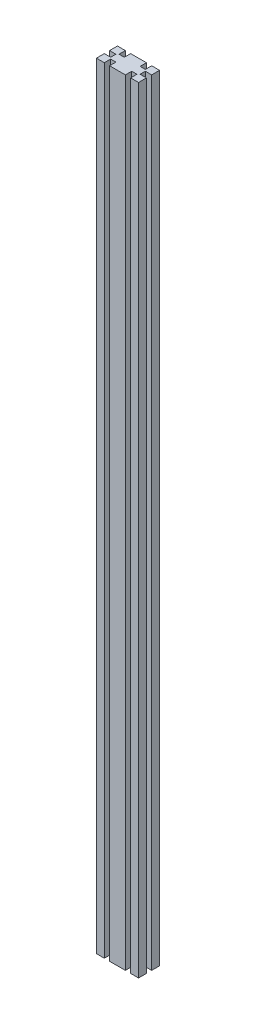
ISO-10303-21;
HEADER;
FILE_DESCRIPTION(('STEP AP214'),'2;1');
FILE_NAME('part.step','',(''),(''),'','','');
FILE_SCHEMA(('AUTOMOTIVE_DESIGN { 1 0 10303 214 1 1 1 1 }'));
ENDSEC;
DATA;
#1=APPLICATION_CONTEXT('core data for automotive mechanical design processes');
#2=APPLICATION_PROTOCOL_DEFINITION('international standard','automotive_design',2000,#1);
#3=PRODUCT_CONTEXT('',#1,'mechanical');
#4=PRODUCT('Part','Part','',(#3));
#5=PRODUCT_RELATED_PRODUCT_CATEGORY('part','',(#4));
#6=PRODUCT_DEFINITION_FORMATION('','',#4);
#7=PRODUCT_DEFINITION_CONTEXT('part definition',#1,'design');
#8=PRODUCT_DEFINITION('design','',#6,#7);
#9=PRODUCT_DEFINITION_SHAPE('','',#8);
#10=(LENGTH_UNIT() NAMED_UNIT(*) SI_UNIT(.MILLI.,.METRE.));
#11=(NAMED_UNIT(*) PLANE_ANGLE_UNIT() SI_UNIT($,.RADIAN.));
#12=(NAMED_UNIT(*) SI_UNIT($,.STERADIAN.) SOLID_ANGLE_UNIT());
#13=UNCERTAINTY_MEASURE_WITH_UNIT(LENGTH_MEASURE(1.E-05),#10,'distance_accuracy_value','');
#14=(GEOMETRIC_REPRESENTATION_CONTEXT(3) GLOBAL_UNCERTAINTY_ASSIGNED_CONTEXT((#13)) GLOBAL_UNIT_ASSIGNED_CONTEXT((#10,
#11,#12)) REPRESENTATION_CONTEXT('',''));
#15=CARTESIAN_POINT('',(0.,0.,0.));
#16=DIRECTION('',(0.,0.,1.));
#17=DIRECTION('',(1.,0.,0.));
#18=AXIS2_PLACEMENT_3D('',#15,#16,#17);
#19=CARTESIAN_POINT('',(20.,-368.3,10.));
#20=DIRECTION('',(1.,0.,0.));
#21=DIRECTION('',(0.,0.,-1.));
#22=AXIS2_PLACEMENT_3D('',#19,#20,#21);
#23=PLANE('',#22);
#24=DIRECTION('',(0.,0.,-1.));
#25=VECTOR('',#24,1.);
#26=CARTESIAN_POINT('',(20.,368.3,10.));
#27=LINE('',#26,#25);
#28=CARTESIAN_POINT('',(20.,368.3,-2.5));
#29=VERTEX_POINT('',#28);
#30=CARTESIAN_POINT('',(20.,368.3,-10.));
#31=VERTEX_POINT('',#30);
#32=EDGE_CURVE('E375',#29,#31,#27,.T.);
#33=ORIENTED_EDGE('',*,*,#32,.F.);
#34=DIRECTION('',(0.,-1.,0.));
#35=VECTOR('',#34,1.);
#36=CARTESIAN_POINT('',(20.,-368.3,-2.5));
#37=LINE('',#36,#35);
#38=CARTESIAN_POINT('',(20.,-368.3,-2.5));
#39=VERTEX_POINT('',#38);
#40=EDGE_CURVE('E357',#29,#39,#37,.T.);
#41=ORIENTED_EDGE('',*,*,#40,.T.);
#42=DIRECTION('',(0.,0.,-1.));
#43=VECTOR('',#42,1.);
#44=CARTESIAN_POINT('',(20.,-368.3,10.));
#45=LINE('',#44,#43);
#46=CARTESIAN_POINT('',(20.,-368.3,-10.));
#47=VERTEX_POINT('',#46);
#48=EDGE_CURVE('E392',#39,#47,#45,.T.);
#49=ORIENTED_EDGE('',*,*,#48,.T.);
#50=DIRECTION('',(0.,1.,0.));
#51=VECTOR('',#50,1.);
#52=CARTESIAN_POINT('',(20.,-368.3,-10.));
#53=LINE('',#52,#51);
#54=EDGE_CURVE('E37',#47,#31,#53,.T.);
#55=ORIENTED_EDGE('',*,*,#54,.T.);
#56=EDGE_LOOP('',(#33,#41,#49,#55));
#57=FACE_BOUND('',#56,.T.);
#58=ADVANCED_FACE('F33',(#57),#23,.T.);
#59=CARTESIAN_POINT('',(-20.,-368.3,10.));
#60=DIRECTION('',(0.,0.,1.));
#61=DIRECTION('',(1.,0.,0.));
#62=AXIS2_PLACEMENT_3D('',#59,#60,#61);
#63=PLANE('',#62);
#64=DIRECTION('',(1.,0.,0.));
#65=VECTOR('',#64,1.);
#66=CARTESIAN_POINT('',(-20.,368.3,10.));
#67=LINE('',#66,#65);
#68=CARTESIAN_POINT('',(-7.5,368.3,10.));
#69=VERTEX_POINT('',#68);
#70=CARTESIAN_POINT('',(7.5,368.3,10.));
#71=VERTEX_POINT('',#70);
#72=EDGE_CURVE('E393',#69,#71,#67,.T.);
#73=ORIENTED_EDGE('',*,*,#72,.F.);
#74=DIRECTION('',(0.,-1.,0.));
#75=VECTOR('',#74,1.);
#76=CARTESIAN_POINT('',(-7.5,-368.3,10.));
#77=LINE('',#76,#75);
#78=CARTESIAN_POINT('',(-7.5,-368.3,10.));
#79=VERTEX_POINT('',#78);
#80=EDGE_CURVE('E372',#69,#79,#77,.T.);
#81=ORIENTED_EDGE('',*,*,#80,.T.);
#82=DIRECTION('',(1.,0.,0.));
#83=VECTOR('',#82,1.);
#84=CARTESIAN_POINT('',(-20.,-368.3,10.));
#85=LINE('',#84,#83);
#86=CARTESIAN_POINT('',(7.5,-368.3,10.));
#87=VERTEX_POINT('',#86);
#88=EDGE_CURVE('E409',#79,#87,#85,.T.);
#89=ORIENTED_EDGE('',*,*,#88,.T.);
#90=DIRECTION('',(0.,-1.,0.));
#91=VECTOR('',#90,1.);
#92=CARTESIAN_POINT('',(7.5,-368.3,10.));
#93=LINE('',#92,#91);
#94=EDGE_CURVE('E352',#71,#87,#93,.T.);
#95=ORIENTED_EDGE('',*,*,#94,.F.);
#96=EDGE_LOOP('',(#73,#81,#89,#95));
#97=FACE_BOUND('',#96,.T.);
#98=ADVANCED_FACE('F493',(#97),#63,.T.);
#99=CARTESIAN_POINT('',(12.5,368.3,10.));
#100=VERTEX_POINT('',#99);
#101=CARTESIAN_POINT('',(20.,368.3,10.));
#102=VERTEX_POINT('',#101);
#103=EDGE_CURVE('E388',#100,#102,#67,.T.);
#104=ORIENTED_EDGE('',*,*,#103,.F.);
#105=DIRECTION('',(0.,-1.,0.));
#106=VECTOR('',#105,1.);
#107=CARTESIAN_POINT('',(12.5,-368.3,10.));
#108=LINE('',#107,#106);
#109=CARTESIAN_POINT('',(12.5,-368.3,10.));
#110=VERTEX_POINT('',#109);
#111=EDGE_CURVE('E236',#100,#110,#108,.T.);
#112=ORIENTED_EDGE('',*,*,#111,.T.);
#113=CARTESIAN_POINT('',(20.,-368.3,10.));
#114=VERTEX_POINT('',#113);
#115=EDGE_CURVE('E406',#110,#114,#85,.T.);
#116=ORIENTED_EDGE('',*,*,#115,.T.);
#117=DIRECTION('',(0.,1.,0.));
#118=VECTOR('',#117,1.);
#119=CARTESIAN_POINT('',(20.,-368.3,10.));
#120=LINE('',#119,#118);
#121=EDGE_CURVE('E11',#114,#102,#120,.T.);
#122=ORIENTED_EDGE('',*,*,#121,.T.);
#123=EDGE_LOOP('',(#104,#112,#116,#122));
#124=FACE_BOUND('',#123,.T.);
#125=ADVANCED_FACE('F497',(#124),#63,.T.);
#126=CARTESIAN_POINT('',(-20.,-368.3,10.));
#127=DIRECTION('',(-1.,0.,0.));
#128=DIRECTION('',(0.,0.,1.));
#129=AXIS2_PLACEMENT_3D('',#126,#127,#128);
#130=PLANE('',#129);
#131=DIRECTION('',(0.,0.,1.));
#132=VECTOR('',#131,1.);
#133=CARTESIAN_POINT('',(-20.,368.3,10.));
#134=LINE('',#133,#132);
#135=CARTESIAN_POINT('',(-20.,368.3,2.5));
#136=VERTEX_POINT('',#135);
#137=CARTESIAN_POINT('',(-20.,368.3,10.));
#138=VERTEX_POINT('',#137);
#139=EDGE_CURVE('E383',#136,#138,#134,.T.);
#140=ORIENTED_EDGE('',*,*,#139,.F.);
#141=DIRECTION('',(0.,-1.,0.));
#142=VECTOR('',#141,1.);
#143=CARTESIAN_POINT('',(-20.,-368.3,2.5));
#144=LINE('',#143,#142);
#145=CARTESIAN_POINT('',(-20.,-368.3,2.5));
#146=VERTEX_POINT('',#145);
#147=EDGE_CURVE('E365',#136,#146,#144,.T.);
#148=ORIENTED_EDGE('',*,*,#147,.T.);
#149=DIRECTION('',(0.,0.,1.));
#150=VECTOR('',#149,1.);
#151=CARTESIAN_POINT('',(-20.,-368.3,10.));
#152=LINE('',#151,#150);
#153=CARTESIAN_POINT('',(-20.,-368.3,10.));
#154=VERTEX_POINT('',#153);
#155=EDGE_CURVE('E401',#146,#154,#152,.T.);
#156=ORIENTED_EDGE('',*,*,#155,.T.);
#157=DIRECTION('',(0.,1.,0.));
#158=VECTOR('',#157,1.);
#159=CARTESIAN_POINT('',(-20.,-368.3,10.));
#160=LINE('',#159,#158);
#161=EDGE_CURVE('E42',#154,#138,#160,.T.);
#162=ORIENTED_EDGE('',*,*,#161,.T.);
#163=EDGE_LOOP('',(#140,#148,#156,#162));
#164=FACE_BOUND('',#163,.T.);
#165=ADVANCED_FACE('F689',(#164),#130,.T.);
#166=CARTESIAN_POINT('',(-20.,-368.3,-10.));
#167=DIRECTION('',(0.,0.,-1.));
#168=DIRECTION('',(-1.,0.,0.));
#169=AXIS2_PLACEMENT_3D('',#166,#167,#168);
#170=PLANE('',#169);
#171=DIRECTION('',(-1.,0.,0.));
#172=VECTOR('',#171,1.);
#173=CARTESIAN_POINT('',(-20.,368.3,-10.));
#174=LINE('',#173,#172);
#175=CARTESIAN_POINT('',(7.5,368.3,-10.));
#176=VERTEX_POINT('',#175);
#177=CARTESIAN_POINT('',(-7.5,368.3,-10.));
#178=VERTEX_POINT('',#177);
#179=EDGE_CURVE('E384',#176,#178,#174,.T.);
#180=ORIENTED_EDGE('',*,*,#179,.F.);
#181=DIRECTION('',(0.,-1.,0.));
#182=VECTOR('',#181,1.);
#183=CARTESIAN_POINT('',(7.5,-368.3,-10.));
#184=LINE('',#183,#182);
#185=CARTESIAN_POINT('',(7.5,-368.3,-10.));
#186=VERTEX_POINT('',#185);
#187=EDGE_CURVE('E362',#176,#186,#184,.T.);
#188=ORIENTED_EDGE('',*,*,#187,.T.);
#189=DIRECTION('',(-1.,0.,0.));
#190=VECTOR('',#189,1.);
#191=CARTESIAN_POINT('',(-20.,-368.3,-10.));
#192=LINE('',#191,#190);
#193=CARTESIAN_POINT('',(-7.5,-368.3,-10.));
#194=VERTEX_POINT('',#193);
#195=EDGE_CURVE('E402',#186,#194,#192,.T.);
#196=ORIENTED_EDGE('',*,*,#195,.T.);
#197=DIRECTION('',(0.,-1.,0.));
#198=VECTOR('',#197,1.);
#199=CARTESIAN_POINT('',(-7.5,-368.3,-10.));
#200=LINE('',#199,#198);
#201=EDGE_CURVE('E345',#178,#194,#200,.T.);
#202=ORIENTED_EDGE('',*,*,#201,.F.);
#203=EDGE_LOOP('',(#180,#188,#196,#202));
#204=FACE_BOUND('',#203,.T.);
#205=ADVANCED_FACE('F475',(#204),#170,.T.);
#206=CARTESIAN_POINT('',(-12.5,368.3,-10.));
#207=VERTEX_POINT('',#206);
#208=CARTESIAN_POINT('',(-20.,368.3,-10.));
#209=VERTEX_POINT('',#208);
#210=EDGE_CURVE('E379',#207,#209,#174,.T.);
#211=ORIENTED_EDGE('',*,*,#210,.F.);
#212=DIRECTION('',(0.,-1.,0.));
#213=VECTOR('',#212,1.);
#214=CARTESIAN_POINT('',(-12.5,-368.3,-10.));
#215=LINE('',#214,#213);
#216=CARTESIAN_POINT('',(-12.5,-368.3,-10.));
#217=VERTEX_POINT('',#216);
#218=EDGE_CURVE('E349',#207,#217,#215,.T.);
#219=ORIENTED_EDGE('',*,*,#218,.T.);
#220=CARTESIAN_POINT('',(-20.,-368.3,-10.));
#221=VERTEX_POINT('',#220);
#222=EDGE_CURVE('E397',#217,#221,#192,.T.);
#223=ORIENTED_EDGE('',*,*,#222,.T.);
#224=DIRECTION('',(0.,1.,0.));
#225=VECTOR('',#224,1.);
#226=CARTESIAN_POINT('',(-20.,-368.3,-10.));
#227=LINE('',#226,#225);
#228=EDGE_CURVE('E412',#221,#209,#227,.T.);
#229=ORIENTED_EDGE('',*,*,#228,.T.);
#230=EDGE_LOOP('',(#211,#219,#223,#229));
#231=FACE_BOUND('',#230,.T.);
#232=ADVANCED_FACE('F457',(#231),#170,.T.);
#233=CARTESIAN_POINT('',(0.,-368.3,0.));
#234=DIRECTION('',(0.,-1.,0.));
#235=DIRECTION('',(0.,0.,-1.));
#236=AXIS2_PLACEMENT_3D('',#233,#234,#235);
#237=PLANE('',#236);
#238=ORIENTED_EDGE('',*,*,#88,.F.);
#239=DIRECTION('',(0.,0.,1.));
#240=VECTOR('',#239,1.);
#241=CARTESIAN_POINT('',(-7.5,-368.3,0.));
#242=LINE('',#241,#240);
#243=CARTESIAN_POINT('',(-7.5,-368.3,4.));
#244=VERTEX_POINT('',#243);
#245=EDGE_CURVE('E266',#244,#79,#242,.T.);
#246=ORIENTED_EDGE('',*,*,#245,.F.);
#247=DIRECTION('',(1.,0.,0.));
#248=VECTOR('',#247,1.);
#249=CARTESIAN_POINT('',(0.,-368.3,4.));
#250=LINE('',#249,#248);
#251=CARTESIAN_POINT('',(-12.5,-368.3,4.));
#252=VERTEX_POINT('',#251);
#253=EDGE_CURVE('E261',#252,#244,#250,.T.);
#254=ORIENTED_EDGE('',*,*,#253,.F.);
#255=DIRECTION('',(0.,0.,1.));
#256=VECTOR('',#255,1.);
#257=CARTESIAN_POINT('',(-12.5,-368.3,0.));
#258=LINE('',#257,#256);
#259=CARTESIAN_POINT('',(-12.5,-368.3,10.));
#260=VERTEX_POINT('',#259);
#261=EDGE_CURVE('E263',#252,#260,#258,.T.);
#262=ORIENTED_EDGE('',*,*,#261,.T.);
#263=EDGE_CURVE('E407',#154,#260,#85,.T.);
#264=ORIENTED_EDGE('',*,*,#263,.F.);
#265=ORIENTED_EDGE('',*,*,#155,.F.);
#266=DIRECTION('',(-1.,0.,0.));
#267=VECTOR('',#266,1.);
#268=CARTESIAN_POINT('',(0.,-368.3,2.5));
#269=LINE('',#268,#267);
#270=CARTESIAN_POINT('',(-14.,-368.3,2.5));
#271=VERTEX_POINT('',#270);
#272=EDGE_CURVE('E285',#271,#146,#269,.T.);
#273=ORIENTED_EDGE('',*,*,#272,.F.);
#274=DIRECTION('',(0.,0.,1.));
#275=VECTOR('',#274,1.);
#276=CARTESIAN_POINT('',(-14.,-368.3,0.));
#277=LINE('',#276,#275);
#278=CARTESIAN_POINT('',(-14.,-368.3,-2.5));
#279=VERTEX_POINT('',#278);
#280=EDGE_CURVE('E287',#279,#271,#277,.T.);
#281=ORIENTED_EDGE('',*,*,#280,.F.);
#282=DIRECTION('',(-1.,0.,0.));
#283=VECTOR('',#282,1.);
#284=CARTESIAN_POINT('',(0.,-368.3,-2.5));
#285=LINE('',#284,#283);
#286=CARTESIAN_POINT('',(-20.,-368.3,-2.5));
#287=VERTEX_POINT('',#286);
#288=EDGE_CURVE('E282',#279,#287,#285,.T.);
#289=ORIENTED_EDGE('',*,*,#288,.T.);
#290=EDGE_CURVE('E403',#221,#287,#152,.T.);
#291=ORIENTED_EDGE('',*,*,#290,.F.);
#292=ORIENTED_EDGE('',*,*,#222,.F.);
#293=DIRECTION('',(0.,0.,-1.));
#294=VECTOR('',#293,1.);
#295=CARTESIAN_POINT('',(-12.5,-368.3,0.));
#296=LINE('',#295,#294);
#297=CARTESIAN_POINT('',(-12.5,-368.3,-4.));
#298=VERTEX_POINT('',#297);
#299=EDGE_CURVE('E340',#298,#217,#296,.T.);
#300=ORIENTED_EDGE('',*,*,#299,.F.);
#301=DIRECTION('',(1.,0.,0.));
#302=VECTOR('',#301,1.);
#303=CARTESIAN_POINT('',(0.,-368.3,-4.));
#304=LINE('',#303,#302);
#305=CARTESIAN_POINT('',(-7.5,-368.3,-4.));
#306=VERTEX_POINT('',#305);
#307=EDGE_CURVE('E334',#298,#306,#304,.T.);
#308=ORIENTED_EDGE('',*,*,#307,.T.);
#309=DIRECTION('',(0.,0.,-1.));
#310=VECTOR('',#309,1.);
#311=CARTESIAN_POINT('',(-7.5,-368.3,0.));
#312=LINE('',#311,#310);
#313=EDGE_CURVE('E337',#306,#194,#312,.T.);
#314=ORIENTED_EDGE('',*,*,#313,.T.);
#315=ORIENTED_EDGE('',*,*,#195,.F.);
#316=DIRECTION('',(0.,0.,-1.));
#317=VECTOR('',#316,1.);
#318=CARTESIAN_POINT('',(7.5,-368.3,0.));
#319=LINE('',#318,#317);
#320=CARTESIAN_POINT('',(7.5,-368.3,-4.));
#321=VERTEX_POINT('',#320);
#322=EDGE_CURVE('E304',#321,#186,#319,.T.);
#323=ORIENTED_EDGE('',*,*,#322,.F.);
#324=DIRECTION('',(-1.,0.,0.));
#325=VECTOR('',#324,1.);
#326=CARTESIAN_POINT('',(0.,-368.3,-4.));
#327=LINE('',#326,#325);
#328=CARTESIAN_POINT('',(12.5,-368.3,-4.));
#329=VERTEX_POINT('',#328);
#330=EDGE_CURVE('E299',#329,#321,#327,.T.);
#331=ORIENTED_EDGE('',*,*,#330,.F.);
#332=DIRECTION('',(0.,0.,-1.));
#333=VECTOR('',#332,1.);
#334=CARTESIAN_POINT('',(12.5,-368.3,0.));
#335=LINE('',#334,#333);
#336=CARTESIAN_POINT('',(12.5,-368.3,-10.));
#337=VERTEX_POINT('',#336);
#338=EDGE_CURVE('E301',#329,#337,#335,.T.);
#339=ORIENTED_EDGE('',*,*,#338,.T.);
#340=EDGE_CURVE('E398',#47,#337,#192,.T.);
#341=ORIENTED_EDGE('',*,*,#340,.F.);
#342=ORIENTED_EDGE('',*,*,#48,.F.);
#343=DIRECTION('',(1.,0.,0.));
#344=VECTOR('',#343,1.);
#345=CARTESIAN_POINT('',(0.,-368.3,-2.5));
#346=LINE('',#345,#344);
#347=CARTESIAN_POINT('',(14.,-368.3,-2.5));
#348=VERTEX_POINT('',#347);
#349=EDGE_CURVE('E316',#348,#39,#346,.T.);
#350=ORIENTED_EDGE('',*,*,#349,.F.);
#351=DIRECTION('',(0.,0.,1.));
#352=VECTOR('',#351,1.);
#353=CARTESIAN_POINT('',(14.,-368.3,0.));
#354=LINE('',#353,#352);
#355=CARTESIAN_POINT('',(14.,-368.3,2.5));
#356=VERTEX_POINT('',#355);
#357=EDGE_CURVE('E318',#348,#356,#354,.T.);
#358=ORIENTED_EDGE('',*,*,#357,.T.);
#359=DIRECTION('',(1.,0.,0.));
#360=VECTOR('',#359,1.);
#361=CARTESIAN_POINT('',(0.,-368.3,2.5));
#362=LINE('',#361,#360);
#363=CARTESIAN_POINT('',(20.,-368.3,2.5));
#364=VERTEX_POINT('',#363);
#365=EDGE_CURVE('E321',#356,#364,#362,.T.);
#366=ORIENTED_EDGE('',*,*,#365,.T.);
#367=EDGE_CURVE('E394',#114,#364,#45,.T.);
#368=ORIENTED_EDGE('',*,*,#367,.F.);
#369=ORIENTED_EDGE('',*,*,#115,.F.);
#370=DIRECTION('',(0.,0.,1.));
#371=VECTOR('',#370,1.);
#372=CARTESIAN_POINT('',(12.5,-368.3,0.));
#373=LINE('',#372,#371);
#374=CARTESIAN_POINT('',(12.5,-368.3,4.));
#375=VERTEX_POINT('',#374);
#376=EDGE_CURVE('E252',#375,#110,#373,.T.);
#377=ORIENTED_EDGE('',*,*,#376,.F.);
#378=DIRECTION('',(-1.,0.,0.));
#379=VECTOR('',#378,1.);
#380=CARTESIAN_POINT('',(0.,-368.3,4.));
#381=LINE('',#380,#379);
#382=CARTESIAN_POINT('',(7.5,-368.3,4.));
#383=VERTEX_POINT('',#382);
#384=EDGE_CURVE('E226',#375,#383,#381,.T.);
#385=ORIENTED_EDGE('',*,*,#384,.T.);
#386=DIRECTION('',(0.,0.,1.));
#387=VECTOR('',#386,1.);
#388=CARTESIAN_POINT('',(7.5,-368.3,0.));
#389=LINE('',#388,#387);
#390=EDGE_CURVE('E249',#383,#87,#389,.T.);
#391=ORIENTED_EDGE('',*,*,#390,.T.);
#392=EDGE_LOOP('',(#238,#246,#254,#262,#264,#265,#273,#281,#289,#291,#292,#300,#308,#314,#315,
#323,#331,#339,#341,#342,#350,#358,#366,#368,#369,#377,#385,#391));
#393=FACE_BOUND('',#392,.T.);
#394=ADVANCED_FACE('F440',(#393),#237,.T.);
#395=CARTESIAN_POINT('',(0.,368.3,0.));
#396=DIRECTION('',(0.,-1.,0.));
#397=DIRECTION('',(0.,0.,-1.));
#398=AXIS2_PLACEMENT_3D('',#395,#396,#397);
#399=PLANE('',#398);
#400=DIRECTION('',(0.,0.,1.));
#401=VECTOR('',#400,1.);
#402=CARTESIAN_POINT('',(-7.5,368.3,0.));
#403=LINE('',#402,#401);
#404=CARTESIAN_POINT('',(-7.5,368.3,4.));
#405=VERTEX_POINT('',#404);
#406=EDGE_CURVE('E259',#405,#69,#403,.T.);
#407=ORIENTED_EDGE('',*,*,#406,.T.);
#408=ORIENTED_EDGE('',*,*,#72,.T.);
#409=DIRECTION('',(0.,0.,1.));
#410=VECTOR('',#409,1.);
#411=CARTESIAN_POINT('',(7.5,368.3,0.));
#412=LINE('',#411,#410);
#413=CARTESIAN_POINT('',(7.5,368.3,4.));
#414=VERTEX_POINT('',#413);
#415=EDGE_CURVE('E239',#414,#71,#412,.T.);
#416=ORIENTED_EDGE('',*,*,#415,.F.);
#417=DIRECTION('',(-1.,0.,0.));
#418=VECTOR('',#417,1.);
#419=CARTESIAN_POINT('',(0.,368.3,4.));
#420=LINE('',#419,#418);
#421=CARTESIAN_POINT('',(12.5,368.3,4.));
#422=VERTEX_POINT('',#421);
#423=EDGE_CURVE('E223',#422,#414,#420,.T.);
#424=ORIENTED_EDGE('',*,*,#423,.F.);
#425=DIRECTION('',(0.,0.,1.));
#426=VECTOR('',#425,1.);
#427=CARTESIAN_POINT('',(12.5,368.3,0.));
#428=LINE('',#427,#426);
#429=EDGE_CURVE('E233',#422,#100,#428,.T.);
#430=ORIENTED_EDGE('',*,*,#429,.T.);
#431=ORIENTED_EDGE('',*,*,#103,.T.);
#432=CARTESIAN_POINT('',(20.,368.3,2.5));
#433=VERTEX_POINT('',#432);
#434=EDGE_CURVE('E376',#102,#433,#27,.T.);
#435=ORIENTED_EDGE('',*,*,#434,.T.);
#436=DIRECTION('',(1.,0.,0.));
#437=VECTOR('',#436,1.);
#438=CARTESIAN_POINT('',(0.,368.3,2.5));
#439=LINE('',#438,#437);
#440=CARTESIAN_POINT('',(14.,368.3,2.5));
#441=VERTEX_POINT('',#440);
#442=EDGE_CURVE('E314',#441,#433,#439,.T.);
#443=ORIENTED_EDGE('',*,*,#442,.F.);
#444=DIRECTION('',(0.,0.,1.));
#445=VECTOR('',#444,1.);
#446=CARTESIAN_POINT('',(14.,368.3,0.));
#447=LINE('',#446,#445);
#448=CARTESIAN_POINT('',(14.,368.3,-2.5));
#449=VERTEX_POINT('',#448);
#450=EDGE_CURVE('E311',#449,#441,#447,.T.);
#451=ORIENTED_EDGE('',*,*,#450,.F.);
#452=DIRECTION('',(1.,0.,0.));
#453=VECTOR('',#452,1.);
#454=CARTESIAN_POINT('',(0.,368.3,-2.5));
#455=LINE('',#454,#453);
#456=EDGE_CURVE('E229',#449,#29,#455,.T.);
#457=ORIENTED_EDGE('',*,*,#456,.T.);
#458=ORIENTED_EDGE('',*,*,#32,.T.);
#459=CARTESIAN_POINT('',(12.5,368.3,-10.));
#460=VERTEX_POINT('',#459);
#461=EDGE_CURVE('E380',#31,#460,#174,.T.);
#462=ORIENTED_EDGE('',*,*,#461,.T.);
#463=DIRECTION('',(0.,0.,-1.));
#464=VECTOR('',#463,1.);
#465=CARTESIAN_POINT('',(12.5,368.3,0.));
#466=LINE('',#465,#464);
#467=CARTESIAN_POINT('',(12.5,368.3,-4.));
#468=VERTEX_POINT('',#467);
#469=EDGE_CURVE('E293',#468,#460,#466,.T.);
#470=ORIENTED_EDGE('',*,*,#469,.F.);
#471=DIRECTION('',(-1.,0.,0.));
#472=VECTOR('',#471,1.);
#473=CARTESIAN_POINT('',(0.,368.3,-4.));
#474=LINE('',#473,#472);
#475=CARTESIAN_POINT('',(7.5,368.3,-4.));
#476=VERTEX_POINT('',#475);
#477=EDGE_CURVE('E58',#468,#476,#474,.T.);
#478=ORIENTED_EDGE('',*,*,#477,.T.);
#479=DIRECTION('',(0.,0.,-1.));
#480=VECTOR('',#479,1.);
#481=CARTESIAN_POINT('',(7.5,368.3,0.));
#482=LINE('',#481,#480);
#483=EDGE_CURVE('E296',#476,#176,#482,.T.);
#484=ORIENTED_EDGE('',*,*,#483,.T.);
#485=ORIENTED_EDGE('',*,*,#179,.T.);
#486=DIRECTION('',(0.,0.,-1.));
#487=VECTOR('',#486,1.);
#488=CARTESIAN_POINT('',(-7.5,368.3,0.));
#489=LINE('',#488,#487);
#490=CARTESIAN_POINT('',(-7.5,368.3,-4.));
#491=VERTEX_POINT('',#490);
#492=EDGE_CURVE('E329',#491,#178,#489,.T.);
#493=ORIENTED_EDGE('',*,*,#492,.F.);
#494=DIRECTION('',(1.,0.,0.));
#495=VECTOR('',#494,1.);
#496=CARTESIAN_POINT('',(0.,368.3,-4.));
#497=LINE('',#496,#495);
#498=CARTESIAN_POINT('',(-12.5,368.3,-4.));
#499=VERTEX_POINT('',#498);
#500=EDGE_CURVE('E271',#499,#491,#497,.T.);
#501=ORIENTED_EDGE('',*,*,#500,.F.);
#502=DIRECTION('',(0.,0.,-1.));
#503=VECTOR('',#502,1.);
#504=CARTESIAN_POINT('',(-12.5,368.3,0.));
#505=LINE('',#504,#503);
#506=EDGE_CURVE('E331',#499,#207,#505,.T.);
#507=ORIENTED_EDGE('',*,*,#506,.T.);
#508=ORIENTED_EDGE('',*,*,#210,.T.);
#509=CARTESIAN_POINT('',(-20.,368.3,-2.5));
#510=VERTEX_POINT('',#509);
#511=EDGE_CURVE('E385',#209,#510,#134,.T.);
#512=ORIENTED_EDGE('',*,*,#511,.T.);
#513=DIRECTION('',(-1.,0.,0.));
#514=VECTOR('',#513,1.);
#515=CARTESIAN_POINT('',(0.,368.3,-2.5));
#516=LINE('',#515,#514);
#517=CARTESIAN_POINT('',(-14.,368.3,-2.5));
#518=VERTEX_POINT('',#517);
#519=EDGE_CURVE('E273',#518,#510,#516,.T.);
#520=ORIENTED_EDGE('',*,*,#519,.F.);
#521=DIRECTION('',(0.,0.,1.));
#522=VECTOR('',#521,1.);
#523=CARTESIAN_POINT('',(-14.,368.3,0.));
#524=LINE('',#523,#522);
#525=CARTESIAN_POINT('',(-14.,368.3,2.5));
#526=VERTEX_POINT('',#525);
#527=EDGE_CURVE('E279',#518,#526,#524,.T.);
#528=ORIENTED_EDGE('',*,*,#527,.T.);
#529=DIRECTION('',(-1.,0.,0.));
#530=VECTOR('',#529,1.);
#531=CARTESIAN_POINT('',(0.,368.3,2.5));
#532=LINE('',#531,#530);
#533=EDGE_CURVE('E275',#526,#136,#532,.T.);
#534=ORIENTED_EDGE('',*,*,#533,.T.);
#535=ORIENTED_EDGE('',*,*,#139,.T.);
#536=CARTESIAN_POINT('',(-12.5,368.3,10.));
#537=VERTEX_POINT('',#536);
#538=EDGE_CURVE('E389',#138,#537,#67,.T.);
#539=ORIENTED_EDGE('',*,*,#538,.T.);
#540=DIRECTION('',(0.,0.,1.));
#541=VECTOR('',#540,1.);
#542=CARTESIAN_POINT('',(-12.5,368.3,0.));
#543=LINE('',#542,#541);
#544=CARTESIAN_POINT('',(-12.5,368.3,4.));
#545=VERTEX_POINT('',#544);
#546=EDGE_CURVE('E256',#545,#537,#543,.T.);
#547=ORIENTED_EDGE('',*,*,#546,.F.);
#548=DIRECTION('',(1.,0.,0.));
#549=VECTOR('',#548,1.);
#550=CARTESIAN_POINT('',(0.,368.3,4.));
#551=LINE('',#550,#549);
#552=EDGE_CURVE('E50',#545,#405,#551,.T.);
#553=ORIENTED_EDGE('',*,*,#552,.T.);
#554=EDGE_LOOP('',(#407,#408,#416,#424,#430,#431,#435,#443,#451,#457,#458,#462,#470,#478,#484,
#485,#493,#501,#507,#508,#512,#520,#528,#534,#535,#539,#547,#553));
#555=FACE_BOUND('',#554,.T.);
#556=ADVANCED_FACE('F243',(#555),#399,.F.);
#557=DIRECTION('',(0.,-1.,0.));
#558=VECTOR('',#557,1.);
#559=CARTESIAN_POINT('',(20.,-368.3,2.5));
#560=LINE('',#559,#558);
#561=EDGE_CURVE('E355',#433,#364,#560,.T.);
#562=ORIENTED_EDGE('',*,*,#561,.F.);
#563=ORIENTED_EDGE('',*,*,#434,.F.);
#564=ORIENTED_EDGE('',*,*,#121,.F.);
#565=ORIENTED_EDGE('',*,*,#367,.T.);
#566=EDGE_LOOP('',(#562,#563,#564,#565));
#567=FACE_BOUND('',#566,.T.);
#568=ADVANCED_FACE('F35',(#567),#23,.T.);
#569=DIRECTION('',(0.,-1.,0.));
#570=VECTOR('',#569,1.);
#571=CARTESIAN_POINT('',(-12.5,-368.3,10.));
#572=LINE('',#571,#570);
#573=EDGE_CURVE('E370',#537,#260,#572,.T.);
#574=ORIENTED_EDGE('',*,*,#573,.F.);
#575=ORIENTED_EDGE('',*,*,#538,.F.);
#576=ORIENTED_EDGE('',*,*,#161,.F.);
#577=ORIENTED_EDGE('',*,*,#263,.T.);
#578=EDGE_LOOP('',(#574,#575,#576,#577));
#579=FACE_BOUND('',#578,.T.);
#580=ADVANCED_FACE('F500',(#579),#63,.T.);
#581=DIRECTION('',(0.,-1.,0.));
#582=VECTOR('',#581,1.);
#583=CARTESIAN_POINT('',(-20.,-368.3,-2.5));
#584=LINE('',#583,#582);
#585=EDGE_CURVE('E368',#510,#287,#584,.T.);
#586=ORIENTED_EDGE('',*,*,#585,.F.);
#587=ORIENTED_EDGE('',*,*,#511,.F.);
#588=ORIENTED_EDGE('',*,*,#228,.F.);
#589=ORIENTED_EDGE('',*,*,#290,.T.);
#590=EDGE_LOOP('',(#586,#587,#588,#589));
#591=FACE_BOUND('',#590,.T.);
#592=ADVANCED_FACE('F462',(#591),#130,.T.);
#593=DIRECTION('',(0.,-1.,0.));
#594=VECTOR('',#593,1.);
#595=CARTESIAN_POINT('',(12.5,-368.3,-10.));
#596=LINE('',#595,#594);
#597=EDGE_CURVE('E360',#460,#337,#596,.T.);
#598=ORIENTED_EDGE('',*,*,#597,.F.);
#599=ORIENTED_EDGE('',*,*,#461,.F.);
#600=ORIENTED_EDGE('',*,*,#54,.F.);
#601=ORIENTED_EDGE('',*,*,#340,.T.);
#602=EDGE_LOOP('',(#598,#599,#600,#601));
#603=FACE_BOUND('',#602,.T.);
#604=ADVANCED_FACE('F427',(#603),#170,.T.);
#605=CARTESIAN_POINT('',(0.,-368.3,-4.));
#606=DIRECTION('',(0.,0.,1.));
#607=DIRECTION('',(1.,0.,0.));
#608=AXIS2_PLACEMENT_3D('',#605,#606,#607);
#609=PLANE('',#608);
#610=DIRECTION('',(0.,1.,0.));
#611=VECTOR('',#610,1.);
#612=CARTESIAN_POINT('',(-7.5,-368.3,-4.));
#613=LINE('',#612,#611);
#614=EDGE_CURVE('E342',#306,#491,#613,.T.);
#615=ORIENTED_EDGE('',*,*,#614,.F.);
#616=ORIENTED_EDGE('',*,*,#307,.F.);
#617=DIRECTION('',(0.,1.,0.));
#618=VECTOR('',#617,1.);
#619=CARTESIAN_POINT('',(-12.5,-368.3,-4.));
#620=LINE('',#619,#618);
#621=EDGE_CURVE('E343',#298,#499,#620,.T.);
#622=ORIENTED_EDGE('',*,*,#621,.T.);
#623=ORIENTED_EDGE('',*,*,#500,.T.);
#624=EDGE_LOOP('',(#615,#616,#622,#623));
#625=FACE_BOUND('',#624,.T.);
#626=ADVANCED_FACE('F480',(#625),#609,.F.);
#627=CARTESIAN_POINT('',(-12.5,-368.3,0.));
#628=DIRECTION('',(1.,0.,0.));
#629=DIRECTION('',(0.,0.,-1.));
#630=AXIS2_PLACEMENT_3D('',#627,#628,#629);
#631=PLANE('',#630);
#632=ORIENTED_EDGE('',*,*,#506,.F.);
#633=ORIENTED_EDGE('',*,*,#621,.F.);
#634=ORIENTED_EDGE('',*,*,#299,.T.);
#635=ORIENTED_EDGE('',*,*,#218,.F.);
#636=EDGE_LOOP('',(#632,#633,#634,#635));
#637=FACE_BOUND('',#636,.T.);
#638=ADVANCED_FACE('F482',(#637),#631,.T.);
#639=CARTESIAN_POINT('',(-7.5,-368.3,0.));
#640=DIRECTION('',(1.,0.,0.));
#641=DIRECTION('',(0.,0.,-1.));
#642=AXIS2_PLACEMENT_3D('',#639,#640,#641);
#643=PLANE('',#642);
#644=ORIENTED_EDGE('',*,*,#201,.T.);
#645=ORIENTED_EDGE('',*,*,#313,.F.);
#646=ORIENTED_EDGE('',*,*,#614,.T.);
#647=ORIENTED_EDGE('',*,*,#492,.T.);
#648=EDGE_LOOP('',(#644,#645,#646,#647));
#649=FACE_BOUND('',#648,.T.);
#650=ADVANCED_FACE('F477',(#649),#643,.F.);
#651=CARTESIAN_POINT('',(0.,-368.3,4.));
#652=DIRECTION('',(0.,0.,-1.));
#653=DIRECTION('',(-1.,0.,0.));
#654=AXIS2_PLACEMENT_3D('',#651,#652,#653);
#655=PLANE('',#654);
#656=DIRECTION('',(0.,1.,0.));
#657=VECTOR('',#656,1.);
#658=CARTESIAN_POINT('',(7.5,-368.3,4.));
#659=LINE('',#658,#657);
#660=EDGE_CURVE('E230',#383,#414,#659,.T.);
#661=ORIENTED_EDGE('',*,*,#660,.F.);
#662=ORIENTED_EDGE('',*,*,#384,.F.);
#663=DIRECTION('',(0.,1.,0.));
#664=VECTOR('',#663,1.);
#665=CARTESIAN_POINT('',(12.5,-368.3,4.));
#666=LINE('',#665,#664);
#667=EDGE_CURVE('E219',#375,#422,#666,.T.);
#668=ORIENTED_EDGE('',*,*,#667,.T.);
#669=ORIENTED_EDGE('',*,*,#423,.T.);
#670=EDGE_LOOP('',(#661,#662,#668,#669));
#671=FACE_BOUND('',#670,.T.);
#672=ADVANCED_FACE('F221',(#671),#655,.F.);
#673=CARTESIAN_POINT('',(12.5,-368.3,0.));
#674=DIRECTION('',(-1.,0.,0.));
#675=DIRECTION('',(0.,0.,1.));
#676=AXIS2_PLACEMENT_3D('',#673,#674,#675);
#677=PLANE('',#676);
#678=ORIENTED_EDGE('',*,*,#429,.F.);
#679=ORIENTED_EDGE('',*,*,#667,.F.);
#680=ORIENTED_EDGE('',*,*,#376,.T.);
#681=ORIENTED_EDGE('',*,*,#111,.F.);
#682=EDGE_LOOP('',(#678,#679,#680,#681));
#683=FACE_BOUND('',#682,.T.);
#684=ADVANCED_FACE('F234',(#683),#677,.T.);
#685=CARTESIAN_POINT('',(7.5,-368.3,0.));
#686=DIRECTION('',(-1.,0.,0.));
#687=DIRECTION('',(0.,0.,1.));
#688=AXIS2_PLACEMENT_3D('',#685,#686,#687);
#689=PLANE('',#688);
#690=ORIENTED_EDGE('',*,*,#94,.T.);
#691=ORIENTED_EDGE('',*,*,#390,.F.);
#692=ORIENTED_EDGE('',*,*,#660,.T.);
#693=ORIENTED_EDGE('',*,*,#415,.T.);
#694=EDGE_LOOP('',(#690,#691,#692,#693));
#695=FACE_BOUND('',#694,.T.);
#696=ADVANCED_FACE('F524',(#695),#689,.F.);
#697=CARTESIAN_POINT('',(0.,-368.3,-2.5));
#698=DIRECTION('',(0.,0.,1.));
#699=DIRECTION('',(1.,0.,0.));
#700=AXIS2_PLACEMENT_3D('',#697,#698,#699);
#701=PLANE('',#700);
#702=ORIENTED_EDGE('',*,*,#456,.F.);
#703=DIRECTION('',(0.,1.,0.));
#704=VECTOR('',#703,1.);
#705=CARTESIAN_POINT('',(14.,-368.3,-2.5));
#706=LINE('',#705,#704);
#707=EDGE_CURVE('E324',#348,#449,#706,.T.);
#708=ORIENTED_EDGE('',*,*,#707,.F.);
#709=ORIENTED_EDGE('',*,*,#349,.T.);
#710=ORIENTED_EDGE('',*,*,#40,.F.);
#711=EDGE_LOOP('',(#702,#708,#709,#710));
#712=FACE_BOUND('',#711,.T.);
#713=ADVANCED_FACE('F432',(#712),#701,.T.);
#714=CARTESIAN_POINT('',(0.,-368.3,2.5));
#715=DIRECTION('',(0.,0.,1.));
#716=DIRECTION('',(1.,0.,0.));
#717=AXIS2_PLACEMENT_3D('',#714,#715,#716);
#718=PLANE('',#717);
#719=ORIENTED_EDGE('',*,*,#561,.T.);
#720=ORIENTED_EDGE('',*,*,#365,.F.);
#721=DIRECTION('',(0.,1.,0.));
#722=VECTOR('',#721,1.);
#723=CARTESIAN_POINT('',(14.,-368.3,2.5));
#724=LINE('',#723,#722);
#725=EDGE_CURVE('E294',#356,#441,#724,.T.);
#726=ORIENTED_EDGE('',*,*,#725,.T.);
#727=ORIENTED_EDGE('',*,*,#442,.T.);
#728=EDGE_LOOP('',(#719,#720,#726,#727));
#729=FACE_BOUND('',#728,.T.);
#730=ADVANCED_FACE('F516',(#729),#718,.F.);
#731=CARTESIAN_POINT('',(14.,-368.3,0.));
#732=DIRECTION('',(-1.,0.,0.));
#733=DIRECTION('',(0.,0.,1.));
#734=AXIS2_PLACEMENT_3D('',#731,#732,#733);
#735=PLANE('',#734);
#736=ORIENTED_EDGE('',*,*,#725,.F.);
#737=ORIENTED_EDGE('',*,*,#357,.F.);
#738=ORIENTED_EDGE('',*,*,#707,.T.);
#739=ORIENTED_EDGE('',*,*,#450,.T.);
#740=EDGE_LOOP('',(#736,#737,#738,#739));
#741=FACE_BOUND('',#740,.T.);
#742=ADVANCED_FACE('F435',(#741),#735,.F.);
#743=CARTESIAN_POINT('',(0.,-368.3,-4.));
#744=DIRECTION('',(0.,0.,-1.));
#745=DIRECTION('',(-1.,0.,0.));
#746=AXIS2_PLACEMENT_3D('',#743,#744,#745);
#747=PLANE('',#746);
#748=DIRECTION('',(0.,1.,0.));
#749=VECTOR('',#748,1.);
#750=CARTESIAN_POINT('',(12.5,-368.3,-4.));
#751=LINE('',#750,#749);
#752=EDGE_CURVE('E306',#329,#468,#751,.T.);
#753=ORIENTED_EDGE('',*,*,#752,.F.);
#754=ORIENTED_EDGE('',*,*,#330,.T.);
#755=DIRECTION('',(0.,1.,0.));
#756=VECTOR('',#755,1.);
#757=CARTESIAN_POINT('',(7.5,-368.3,-4.));
#758=LINE('',#757,#756);
#759=EDGE_CURVE('E276',#321,#476,#758,.T.);
#760=ORIENTED_EDGE('',*,*,#759,.T.);
#761=ORIENTED_EDGE('',*,*,#477,.F.);
#762=EDGE_LOOP('',(#753,#754,#760,#761));
#763=FACE_BOUND('',#762,.T.);
#764=ADVANCED_FACE('F446',(#763),#747,.T.);
#765=CARTESIAN_POINT('',(7.5,-368.3,0.));
#766=DIRECTION('',(1.,0.,0.));
#767=DIRECTION('',(0.,0.,-1.));
#768=AXIS2_PLACEMENT_3D('',#765,#766,#767);
#769=PLANE('',#768);
#770=ORIENTED_EDGE('',*,*,#483,.F.);
#771=ORIENTED_EDGE('',*,*,#759,.F.);
#772=ORIENTED_EDGE('',*,*,#322,.T.);
#773=ORIENTED_EDGE('',*,*,#187,.F.);
#774=EDGE_LOOP('',(#770,#771,#772,#773));
#775=FACE_BOUND('',#774,.T.);
#776=ADVANCED_FACE('F450',(#775),#769,.T.);
#777=CARTESIAN_POINT('',(12.5,-368.3,0.));
#778=DIRECTION('',(1.,0.,0.));
#779=DIRECTION('',(0.,0.,-1.));
#780=AXIS2_PLACEMENT_3D('',#777,#778,#779);
#781=PLANE('',#780);
#782=ORIENTED_EDGE('',*,*,#597,.T.);
#783=ORIENTED_EDGE('',*,*,#338,.F.);
#784=ORIENTED_EDGE('',*,*,#752,.T.);
#785=ORIENTED_EDGE('',*,*,#469,.T.);
#786=EDGE_LOOP('',(#782,#783,#784,#785));
#787=FACE_BOUND('',#786,.T.);
#788=ADVANCED_FACE('F445',(#787),#781,.F.);
#789=CARTESIAN_POINT('',(0.,-368.3,-2.5));
#790=DIRECTION('',(0.,0.,-1.));
#791=DIRECTION('',(-1.,0.,0.));
#792=AXIS2_PLACEMENT_3D('',#789,#790,#791);
#793=PLANE('',#792);
#794=ORIENTED_EDGE('',*,*,#585,.T.);
#795=ORIENTED_EDGE('',*,*,#288,.F.);
#796=DIRECTION('',(0.,1.,0.));
#797=VECTOR('',#796,1.);
#798=CARTESIAN_POINT('',(-14.,-368.3,-2.5));
#799=LINE('',#798,#797);
#800=EDGE_CURVE('E257',#279,#518,#799,.T.);
#801=ORIENTED_EDGE('',*,*,#800,.T.);
#802=ORIENTED_EDGE('',*,*,#519,.T.);
#803=EDGE_LOOP('',(#794,#795,#801,#802));
#804=FACE_BOUND('',#803,.T.);
#805=ADVANCED_FACE('F467',(#804),#793,.F.);
#806=CARTESIAN_POINT('',(-14.,-368.3,0.));
#807=DIRECTION('',(-1.,0.,0.));
#808=DIRECTION('',(0.,0.,1.));
#809=AXIS2_PLACEMENT_3D('',#806,#807,#808);
#810=PLANE('',#809);
#811=ORIENTED_EDGE('',*,*,#800,.F.);
#812=ORIENTED_EDGE('',*,*,#280,.T.);
#813=DIRECTION('',(0.,1.,0.));
#814=VECTOR('',#813,1.);
#815=CARTESIAN_POINT('',(-14.,-368.3,2.5));
#816=LINE('',#815,#814);
#817=EDGE_CURVE('E289',#271,#526,#816,.T.);
#818=ORIENTED_EDGE('',*,*,#817,.T.);
#819=ORIENTED_EDGE('',*,*,#527,.F.);
#820=EDGE_LOOP('',(#811,#812,#818,#819));
#821=FACE_BOUND('',#820,.T.);
#822=ADVANCED_FACE('F534',(#821),#810,.T.);
#823=CARTESIAN_POINT('',(0.,-368.3,2.5));
#824=DIRECTION('',(0.,0.,-1.));
#825=DIRECTION('',(-1.,0.,0.));
#826=AXIS2_PLACEMENT_3D('',#823,#824,#825);
#827=PLANE('',#826);
#828=ORIENTED_EDGE('',*,*,#533,.F.);
#829=ORIENTED_EDGE('',*,*,#817,.F.);
#830=ORIENTED_EDGE('',*,*,#272,.T.);
#831=ORIENTED_EDGE('',*,*,#147,.F.);
#832=EDGE_LOOP('',(#828,#829,#830,#831));
#833=FACE_BOUND('',#832,.T.);
#834=ADVANCED_FACE('F535',(#833),#827,.T.);
#835=CARTESIAN_POINT('',(0.,-368.3,4.));
#836=DIRECTION('',(0.,0.,1.));
#837=DIRECTION('',(1.,0.,0.));
#838=AXIS2_PLACEMENT_3D('',#835,#836,#837);
#839=PLANE('',#838);
#840=DIRECTION('',(0.,1.,0.));
#841=VECTOR('',#840,1.);
#842=CARTESIAN_POINT('',(-12.5,-368.3,4.));
#843=LINE('',#842,#841);
#844=EDGE_CURVE('E268',#252,#545,#843,.T.);
#845=ORIENTED_EDGE('',*,*,#844,.F.);
#846=ORIENTED_EDGE('',*,*,#253,.T.);
#847=DIRECTION('',(0.,1.,0.));
#848=VECTOR('',#847,1.);
#849=CARTESIAN_POINT('',(-7.5,-368.3,4.));
#850=LINE('',#849,#848);
#851=EDGE_CURVE('E269',#244,#405,#850,.T.);
#852=ORIENTED_EDGE('',*,*,#851,.T.);
#853=ORIENTED_EDGE('',*,*,#552,.F.);
#854=EDGE_LOOP('',(#845,#846,#852,#853));
#855=FACE_BOUND('',#854,.T.);
#856=ADVANCED_FACE('F538',(#855),#839,.T.);
#857=CARTESIAN_POINT('',(-7.5,-368.3,0.));
#858=DIRECTION('',(-1.,0.,0.));
#859=DIRECTION('',(0.,0.,1.));
#860=AXIS2_PLACEMENT_3D('',#857,#858,#859);
#861=PLANE('',#860);
#862=ORIENTED_EDGE('',*,*,#406,.F.);
#863=ORIENTED_EDGE('',*,*,#851,.F.);
#864=ORIENTED_EDGE('',*,*,#245,.T.);
#865=ORIENTED_EDGE('',*,*,#80,.F.);
#866=EDGE_LOOP('',(#862,#863,#864,#865));
#867=FACE_BOUND('',#866,.T.);
#868=ADVANCED_FACE('F545',(#867),#861,.T.);
#869=CARTESIAN_POINT('',(-12.5,-368.3,0.));
#870=DIRECTION('',(-1.,0.,0.));
#871=DIRECTION('',(0.,0.,1.));
#872=AXIS2_PLACEMENT_3D('',#869,#870,#871);
#873=PLANE('',#872);
#874=ORIENTED_EDGE('',*,*,#573,.T.);
#875=ORIENTED_EDGE('',*,*,#261,.F.);
#876=ORIENTED_EDGE('',*,*,#844,.T.);
#877=ORIENTED_EDGE('',*,*,#546,.T.);
#878=EDGE_LOOP('',(#874,#875,#876,#877));
#879=FACE_BOUND('',#878,.T.);
#880=ADVANCED_FACE('F546',(#879),#873,.F.);
#881=CLOSED_SHELL('',(#58,#98,#125,#165,#205,#232,#394,#556,#568,#580,#592,#604,#626,#638,#650,
#672,#684,#696,#713,#730,#742,#764,#776,#788,#805,#822,#834,#856,#868,#880));
#882=MANIFOLD_SOLID_BREP('B2',#881);
#883=ADVANCED_BREP_SHAPE_REPRESENTATION('',(#18,#882),#14);
#884=SHAPE_DEFINITION_REPRESENTATION(#9,#883);
ENDSEC;
END-ISO-10303-21;
